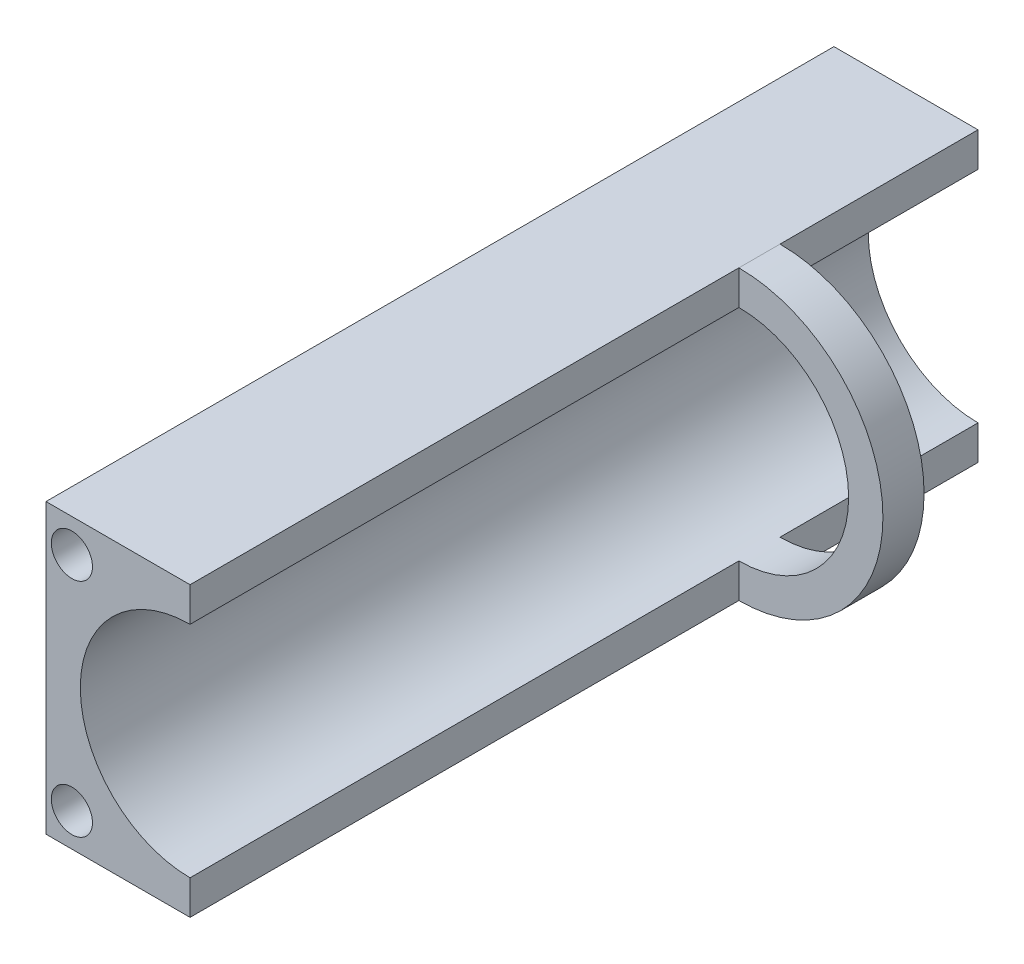
ISO-10303-21;
HEADER;
FILE_DESCRIPTION(('STEP AP214'),'2;1');
FILE_NAME('part.step','',(''),(''),'','','');
FILE_SCHEMA(('AUTOMOTIVE_DESIGN { 1 0 10303 214 1 1 1 1 }'));
ENDSEC;
DATA;
#1=APPLICATION_CONTEXT('core data for automotive mechanical design processes');
#2=APPLICATION_PROTOCOL_DEFINITION('international standard','automotive_design',2000,#1);
#3=PRODUCT_CONTEXT('',#1,'mechanical');
#4=PRODUCT('Part','Part','',(#3));
#5=PRODUCT_RELATED_PRODUCT_CATEGORY('part','',(#4));
#6=PRODUCT_DEFINITION_FORMATION('','',#4);
#7=PRODUCT_DEFINITION_CONTEXT('part definition',#1,'design');
#8=PRODUCT_DEFINITION('design','',#6,#7);
#9=PRODUCT_DEFINITION_SHAPE('','',#8);
#10=(LENGTH_UNIT() NAMED_UNIT(*) SI_UNIT(.MILLI.,.METRE.));
#11=(NAMED_UNIT(*) PLANE_ANGLE_UNIT() SI_UNIT($,.RADIAN.));
#12=(NAMED_UNIT(*) SI_UNIT($,.STERADIAN.) SOLID_ANGLE_UNIT());
#13=UNCERTAINTY_MEASURE_WITH_UNIT(LENGTH_MEASURE(1.E-05),#10,'distance_accuracy_value','');
#14=(GEOMETRIC_REPRESENTATION_CONTEXT(3) GLOBAL_UNCERTAINTY_ASSIGNED_CONTEXT((#13)) GLOBAL_UNIT_ASSIGNED_CONTEXT((#10,
#11,#12)) REPRESENTATION_CONTEXT('',''));
#15=CARTESIAN_POINT('',(0.,0.,0.));
#16=DIRECTION('',(0.,0.,1.));
#17=DIRECTION('',(1.,0.,0.));
#18=AXIS2_PLACEMENT_3D('',#15,#16,#17);
#19=CARTESIAN_POINT('',(0.,-8.,57.43));
#20=DIRECTION('',(-1.,0.,0.));
#21=DIRECTION('',(0.,-1.,0.));
#22=AXIS2_PLACEMENT_3D('',#19,#20,#21);
#23=PLANE('',#22);
#24=DIRECTION('',(0.,1.,0.));
#25=VECTOR('',#24,1.);
#26=CARTESIAN_POINT('',(0.,-8.,14.43));
#27=LINE('',#26,#25);
#28=CARTESIAN_POINT('',(0.,-10.5,14.43));
#29=VERTEX_POINT('',#28);
#30=CARTESIAN_POINT('',(0.,-8.,14.43));
#31=VERTEX_POINT('',#30);
#32=EDGE_CURVE('E176',#29,#31,#27,.T.);
#33=ORIENTED_EDGE('',*,*,#32,.F.);
#34=DIRECTION('',(0.,0.,-1.));
#35=VECTOR('',#34,1.);
#36=CARTESIAN_POINT('',(0.,-10.5,57.43));
#37=LINE('',#36,#35);
#38=CARTESIAN_POINT('',(0.,-10.5,0.));
#39=VERTEX_POINT('',#38);
#40=EDGE_CURVE('E41',#29,#39,#37,.T.);
#41=ORIENTED_EDGE('',*,*,#40,.T.);
#42=DIRECTION('',(0.,1.,0.));
#43=VECTOR('',#42,1.);
#44=CARTESIAN_POINT('',(0.,-8.,0.));
#45=LINE('',#44,#43);
#46=CARTESIAN_POINT('',(0.,-8.,0.));
#47=VERTEX_POINT('',#46);
#48=EDGE_CURVE('E196',#39,#47,#45,.T.);
#49=ORIENTED_EDGE('',*,*,#48,.T.);
#50=DIRECTION('',(0.,0.,-1.));
#51=VECTOR('',#50,1.);
#52=CARTESIAN_POINT('',(0.,-8.,57.43));
#53=LINE('',#52,#51);
#54=EDGE_CURVE('E55',#31,#47,#53,.T.);
#55=ORIENTED_EDGE('',*,*,#54,.F.);
#56=EDGE_LOOP('',(#33,#41,#49,#55));
#57=FACE_BOUND('',#56,.T.);
#58=ADVANCED_FACE('F33',(#57),#23,.F.);
#59=DIRECTION('',(0.,-1.,0.));
#60=VECTOR('',#59,1.);
#61=CARTESIAN_POINT('',(0.,-8.,17.43));
#62=LINE('',#61,#60);
#63=CARTESIAN_POINT('',(0.,-8.,17.43));
#64=VERTEX_POINT('',#63);
#65=CARTESIAN_POINT('',(0.,-10.5,17.43));
#66=VERTEX_POINT('',#65);
#67=EDGE_CURVE('E170',#64,#66,#62,.T.);
#68=ORIENTED_EDGE('',*,*,#67,.F.);
#69=CARTESIAN_POINT('',(0.,-8.,57.43));
#70=VERTEX_POINT('',#69);
#71=EDGE_CURVE('E219',#70,#64,#53,.T.);
#72=ORIENTED_EDGE('',*,*,#71,.F.);
#73=DIRECTION('',(0.,1.,0.));
#74=VECTOR('',#73,1.);
#75=CARTESIAN_POINT('',(0.,-8.,57.43));
#76=LINE('',#75,#74);
#77=CARTESIAN_POINT('',(0.,-10.5,57.43));
#78=VERTEX_POINT('',#77);
#79=EDGE_CURVE('E182',#78,#70,#76,.T.);
#80=ORIENTED_EDGE('',*,*,#79,.F.);
#81=EDGE_CURVE('E11',#78,#66,#37,.T.);
#82=ORIENTED_EDGE('',*,*,#81,.T.);
#83=EDGE_LOOP('',(#68,#72,#80,#82));
#84=FACE_BOUND('',#83,.T.);
#85=ADVANCED_FACE('F272',(#84),#23,.F.);
#86=CARTESIAN_POINT('',(0.,10.5,57.43));
#87=DIRECTION('',(-1.,0.,0.));
#88=DIRECTION('',(0.,-1.,0.));
#89=AXIS2_PLACEMENT_3D('',#86,#87,#88);
#90=PLANE('',#89);
#91=DIRECTION('',(0.,1.,0.));
#92=VECTOR('',#91,1.);
#93=CARTESIAN_POINT('',(0.,10.5,14.43));
#94=LINE('',#93,#92);
#95=CARTESIAN_POINT('',(0.,8.,14.43));
#96=VERTEX_POINT('',#95);
#97=CARTESIAN_POINT('',(0.,10.5,14.43));
#98=VERTEX_POINT('',#97);
#99=EDGE_CURVE('E173',#96,#98,#94,.T.);
#100=ORIENTED_EDGE('',*,*,#99,.F.);
#101=DIRECTION('',(0.,0.,-1.));
#102=VECTOR('',#101,1.);
#103=CARTESIAN_POINT('',(0.,8.,57.43));
#104=LINE('',#103,#102);
#105=CARTESIAN_POINT('',(0.,8.,0.));
#106=VERTEX_POINT('',#105);
#107=EDGE_CURVE('E216',#96,#106,#104,.T.);
#108=ORIENTED_EDGE('',*,*,#107,.T.);
#109=DIRECTION('',(0.,1.,0.));
#110=VECTOR('',#109,1.);
#111=CARTESIAN_POINT('',(0.,10.5,0.));
#112=LINE('',#111,#110);
#113=CARTESIAN_POINT('',(0.,10.5,0.));
#114=VERTEX_POINT('',#113);
#115=EDGE_CURVE('E201',#106,#114,#112,.T.);
#116=ORIENTED_EDGE('',*,*,#115,.T.);
#117=DIRECTION('',(0.,0.,-1.));
#118=VECTOR('',#117,1.);
#119=CARTESIAN_POINT('',(0.,10.5,57.43));
#120=LINE('',#119,#118);
#121=EDGE_CURVE('E212',#98,#114,#120,.T.);
#122=ORIENTED_EDGE('',*,*,#121,.F.);
#123=EDGE_LOOP('',(#100,#108,#116,#122));
#124=FACE_BOUND('',#123,.T.);
#125=ADVANCED_FACE('F239',(#124),#90,.F.);
#126=DIRECTION('',(0.,-1.,0.));
#127=VECTOR('',#126,1.);
#128=CARTESIAN_POINT('',(0.,10.5,17.43));
#129=LINE('',#128,#127);
#130=CARTESIAN_POINT('',(0.,10.5,17.43));
#131=VERTEX_POINT('',#130);
#132=CARTESIAN_POINT('',(0.,8.,17.43));
#133=VERTEX_POINT('',#132);
#134=EDGE_CURVE('E168',#131,#133,#129,.T.);
#135=ORIENTED_EDGE('',*,*,#134,.F.);
#136=CARTESIAN_POINT('',(0.,10.5,57.43));
#137=VERTEX_POINT('',#136);
#138=EDGE_CURVE('E213',#137,#131,#120,.T.);
#139=ORIENTED_EDGE('',*,*,#138,.F.);
#140=DIRECTION('',(0.,1.,0.));
#141=VECTOR('',#140,1.);
#142=CARTESIAN_POINT('',(0.,10.5,57.43));
#143=LINE('',#142,#141);
#144=CARTESIAN_POINT('',(0.,8.,57.43));
#145=VERTEX_POINT('',#144);
#146=EDGE_CURVE('E187',#145,#137,#143,.T.);
#147=ORIENTED_EDGE('',*,*,#146,.F.);
#148=EDGE_CURVE('E217',#145,#133,#104,.T.);
#149=ORIENTED_EDGE('',*,*,#148,.T.);
#150=EDGE_LOOP('',(#135,#139,#147,#149));
#151=FACE_BOUND('',#150,.T.);
#152=ADVANCED_FACE('F251',(#151),#90,.F.);
#153=CARTESIAN_POINT('',(-10.5,-10.5,57.43));
#154=DIRECTION('',(0.,1.,0.));
#155=DIRECTION('',(-1.,0.,0.));
#156=AXIS2_PLACEMENT_3D('',#153,#154,#155);
#157=PLANE('',#156);
#158=DIRECTION('',(1.,0.,0.));
#159=VECTOR('',#158,1.);
#160=CARTESIAN_POINT('',(-10.5,-10.5,0.));
#161=LINE('',#160,#159);
#162=CARTESIAN_POINT('',(-10.5,-10.5,0.));
#163=VERTEX_POINT('',#162);
#164=EDGE_CURVE('E178',#163,#39,#161,.T.);
#165=ORIENTED_EDGE('',*,*,#164,.T.);
#166=ORIENTED_EDGE('',*,*,#40,.F.);
#167=DIRECTION('',(0.,0.,-1.));
#168=VECTOR('',#167,1.);
#169=CARTESIAN_POINT('',(0.,-10.5,0.));
#170=LINE('',#169,#168);
#171=EDGE_CURVE('E48',#66,#29,#170,.T.);
#172=ORIENTED_EDGE('',*,*,#171,.F.);
#173=ORIENTED_EDGE('',*,*,#81,.F.);
#174=DIRECTION('',(1.,0.,0.));
#175=VECTOR('',#174,1.);
#176=CARTESIAN_POINT('',(-10.5,-10.5,57.43));
#177=LINE('',#176,#175);
#178=CARTESIAN_POINT('',(-10.5,-10.5,57.43));
#179=VERTEX_POINT('',#178);
#180=EDGE_CURVE('E179',#179,#78,#177,.T.);
#181=ORIENTED_EDGE('',*,*,#180,.F.);
#182=DIRECTION('',(0.,0.,-1.));
#183=VECTOR('',#182,1.);
#184=CARTESIAN_POINT('',(-10.5,-10.5,57.43));
#185=LINE('',#184,#183);
#186=EDGE_CURVE('E193',#179,#163,#185,.T.);
#187=ORIENTED_EDGE('',*,*,#186,.T.);
#188=EDGE_LOOP('',(#165,#166,#172,#173,#181,#187));
#189=FACE_BOUND('',#188,.T.);
#190=ADVANCED_FACE('F35',(#189),#157,.F.);
#191=CARTESIAN_POINT('',(0.,0.,57.43));
#192=DIRECTION('',(0.,0.,-1.));
#193=DIRECTION('',(-1.,0.,0.));
#194=AXIS2_PLACEMENT_3D('',#191,#192,#193);
#195=CYLINDRICAL_SURFACE('',#194,8.);
#196=ORIENTED_EDGE('',*,*,#71,.T.);
#197=CARTESIAN_POINT('',(0.,0.,17.43));
#198=DIRECTION('',(0.,0.,-1.));
#199=DIRECTION('',(-1.,0.,0.));
#200=AXIS2_PLACEMENT_3D('',#197,#198,#199);
#201=CIRCLE('',#200,8.);
#202=EDGE_CURVE('E159',#133,#64,#201,.T.);
#203=ORIENTED_EDGE('',*,*,#202,.F.);
#204=ORIENTED_EDGE('',*,*,#148,.F.);
#205=CARTESIAN_POINT('',(0.,0.,57.43));
#206=DIRECTION('',(0.,0.,-1.));
#207=DIRECTION('',(1.,0.,0.));
#208=AXIS2_PLACEMENT_3D('',#205,#206,#207);
#209=CIRCLE('',#208,8.);
#210=EDGE_CURVE('E185',#70,#145,#209,.T.);
#211=ORIENTED_EDGE('',*,*,#210,.F.);
#212=EDGE_LOOP('',(#196,#203,#204,#211));
#213=FACE_BOUND('',#212,.T.);
#214=CARTESIAN_POINT('',(0.,0.,14.43));
#215=DIRECTION('',(0.,0.,-1.));
#216=DIRECTION('',(-1.,0.,0.));
#217=AXIS2_PLACEMENT_3D('',#214,#215,#216);
#218=CIRCLE('',#217,8.);
#219=EDGE_CURVE('E162',#96,#31,#218,.T.);
#220=ORIENTED_EDGE('',*,*,#219,.T.);
#221=ORIENTED_EDGE('',*,*,#54,.T.);
#222=CARTESIAN_POINT('',(0.,0.,0.));
#223=DIRECTION('',(0.,0.,-1.));
#224=DIRECTION('',(1.,0.,0.));
#225=AXIS2_PLACEMENT_3D('',#222,#223,#224);
#226=CIRCLE('',#225,8.);
#227=EDGE_CURVE('E198',#47,#106,#226,.T.);
#228=ORIENTED_EDGE('',*,*,#227,.T.);
#229=ORIENTED_EDGE('',*,*,#107,.F.);
#230=EDGE_LOOP('',(#220,#221,#228,#229));
#231=FACE_BOUND('',#230,.T.);
#232=ADVANCED_FACE('F226',(#213,#231),#195,.F.);
#233=CARTESIAN_POINT('',(0.,10.5,57.43));
#234=DIRECTION('',(0.,-1.,0.));
#235=DIRECTION('',(1.,0.,0.));
#236=AXIS2_PLACEMENT_3D('',#233,#234,#235);
#237=PLANE('',#236);
#238=DIRECTION('',(-1.,0.,0.));
#239=VECTOR('',#238,1.);
#240=CARTESIAN_POINT('',(0.,10.5,0.));
#241=LINE('',#240,#239);
#242=CARTESIAN_POINT('',(-10.5,10.5,0.));
#243=VERTEX_POINT('',#242);
#244=EDGE_CURVE('E204',#114,#243,#241,.T.);
#245=ORIENTED_EDGE('',*,*,#244,.T.);
#246=DIRECTION('',(0.,0.,-1.));
#247=VECTOR('',#246,1.);
#248=CARTESIAN_POINT('',(-10.5,10.5,57.43));
#249=LINE('',#248,#247);
#250=CARTESIAN_POINT('',(-10.5,10.5,57.43));
#251=VERTEX_POINT('',#250);
#252=EDGE_CURVE('E209',#251,#243,#249,.T.);
#253=ORIENTED_EDGE('',*,*,#252,.F.);
#254=DIRECTION('',(-1.,0.,0.));
#255=VECTOR('',#254,1.);
#256=CARTESIAN_POINT('',(0.,10.5,57.43));
#257=LINE('',#256,#255);
#258=EDGE_CURVE('E189',#137,#251,#257,.T.);
#259=ORIENTED_EDGE('',*,*,#258,.F.);
#260=ORIENTED_EDGE('',*,*,#138,.T.);
#261=DIRECTION('',(0.,0.,-1.));
#262=VECTOR('',#261,1.);
#263=CARTESIAN_POINT('',(0.,10.5,0.));
#264=LINE('',#263,#262);
#265=EDGE_CURVE('E165',#98,#131,#264,.F.);
#266=ORIENTED_EDGE('',*,*,#265,.F.);
#267=ORIENTED_EDGE('',*,*,#121,.T.);
#268=EDGE_LOOP('',(#245,#253,#259,#260,#266,#267));
#269=FACE_BOUND('',#268,.T.);
#270=ADVANCED_FACE('F256',(#269),#237,.F.);
#271=CARTESIAN_POINT('',(-10.5,10.5,57.43));
#272=DIRECTION('',(1.,0.,0.));
#273=DIRECTION('',(0.,1.,0.));
#274=AXIS2_PLACEMENT_3D('',#271,#272,#273);
#275=PLANE('',#274);
#276=DIRECTION('',(0.,-1.,0.));
#277=VECTOR('',#276,1.);
#278=CARTESIAN_POINT('',(-10.5,10.5,0.));
#279=LINE('',#278,#277);
#280=EDGE_CURVE('E183',#243,#163,#279,.T.);
#281=ORIENTED_EDGE('',*,*,#280,.T.);
#282=ORIENTED_EDGE('',*,*,#186,.F.);
#283=DIRECTION('',(0.,-1.,0.));
#284=VECTOR('',#283,1.);
#285=CARTESIAN_POINT('',(-10.5,10.5,57.43));
#286=LINE('',#285,#284);
#287=EDGE_CURVE('E191',#251,#179,#286,.T.);
#288=ORIENTED_EDGE('',*,*,#287,.F.);
#289=ORIENTED_EDGE('',*,*,#252,.T.);
#290=EDGE_LOOP('',(#281,#282,#288,#289));
#291=FACE_BOUND('',#290,.T.);
#292=ADVANCED_FACE('F268',(#291),#275,.F.);
#293=CARTESIAN_POINT('',(0.,0.,57.43));
#294=DIRECTION('',(0.,0.,1.));
#295=DIRECTION('',(1.,0.,0.));
#296=AXIS2_PLACEMENT_3D('',#293,#294,#295);
#297=PLANE('',#296);
#298=CARTESIAN_POINT('',(-8.61334429823863,8.08,57.43));
#299=DIRECTION('',(0.,0.,1.));
#300=DIRECTION('',(1.,0.,0.));
#301=AXIS2_PLACEMENT_3D('',#298,#299,#300);
#302=CIRCLE('',#301,1.5);
#303=CARTESIAN_POINT('',(-7.11334429823863,8.08,57.43));
#304=VERTEX_POINT('',#303);
#305=EDGE_CURVE('E147',#304,#304,#302,.T.);
#306=ORIENTED_EDGE('',*,*,#305,.F.);
#307=EDGE_LOOP('',(#306));
#308=FACE_BOUND('',#307,.T.);
#309=CARTESIAN_POINT('',(-8.61334429823863,-8.08,57.43));
#310=DIRECTION('',(0.,0.,1.));
#311=DIRECTION('',(1.,0.,0.));
#312=AXIS2_PLACEMENT_3D('',#309,#310,#311);
#313=CIRCLE('',#312,1.5);
#314=CARTESIAN_POINT('',(-7.11334429823863,-8.08,57.43));
#315=VERTEX_POINT('',#314);
#316=EDGE_CURVE('E150',#315,#315,#313,.T.);
#317=ORIENTED_EDGE('',*,*,#316,.F.);
#318=EDGE_LOOP('',(#317));
#319=FACE_BOUND('',#318,.T.);
#320=ORIENTED_EDGE('',*,*,#180,.T.);
#321=ORIENTED_EDGE('',*,*,#79,.T.);
#322=ORIENTED_EDGE('',*,*,#210,.T.);
#323=ORIENTED_EDGE('',*,*,#146,.T.);
#324=ORIENTED_EDGE('',*,*,#258,.T.);
#325=ORIENTED_EDGE('',*,*,#287,.T.);
#326=EDGE_LOOP('',(#320,#321,#322,#323,#324,#325));
#327=FACE_BOUND('',#326,.T.);
#328=ADVANCED_FACE('F260',(#308,#319,#327),#297,.T.);
#329=CARTESIAN_POINT('',(0.,0.,0.));
#330=DIRECTION('',(0.,0.,1.));
#331=DIRECTION('',(1.,0.,0.));
#332=AXIS2_PLACEMENT_3D('',#329,#330,#331);
#333=PLANE('',#332);
#334=CARTESIAN_POINT('',(-8.61334429823864,-8.08,0.));
#335=DIRECTION('',(0.,0.,-1.));
#336=DIRECTION('',(-1.,0.,0.));
#337=AXIS2_PLACEMENT_3D('',#334,#335,#336);
#338=CIRCLE('',#337,1.5);
#339=CARTESIAN_POINT('',(-10.1133442982386,-8.08,0.));
#340=VERTEX_POINT('',#339);
#341=EDGE_CURVE('E141',#340,#340,#338,.T.);
#342=ORIENTED_EDGE('',*,*,#341,.F.);
#343=EDGE_LOOP('',(#342));
#344=FACE_BOUND('',#343,.T.);
#345=CARTESIAN_POINT('',(-8.61334429823864,8.08,0.));
#346=DIRECTION('',(0.,0.,-1.));
#347=DIRECTION('',(-1.,0.,0.));
#348=AXIS2_PLACEMENT_3D('',#345,#346,#347);
#349=CIRCLE('',#348,1.5);
#350=CARTESIAN_POINT('',(-10.1133442982386,8.08,0.));
#351=VERTEX_POINT('',#350);
#352=EDGE_CURVE('E144',#351,#351,#349,.T.);
#353=ORIENTED_EDGE('',*,*,#352,.F.);
#354=EDGE_LOOP('',(#353));
#355=FACE_BOUND('',#354,.T.);
#356=ORIENTED_EDGE('',*,*,#164,.F.);
#357=ORIENTED_EDGE('',*,*,#280,.F.);
#358=ORIENTED_EDGE('',*,*,#244,.F.);
#359=ORIENTED_EDGE('',*,*,#115,.F.);
#360=ORIENTED_EDGE('',*,*,#227,.F.);
#361=ORIENTED_EDGE('',*,*,#48,.F.);
#362=EDGE_LOOP('',(#356,#357,#358,#359,#360,#361));
#363=FACE_BOUND('',#362,.T.);
#364=ADVANCED_FACE('F233',(#344,#355,#363),#333,.F.);
#365=CARTESIAN_POINT('',(0.,-10.5,14.43));
#366=DIRECTION('',(0.,0.,1.));
#367=DIRECTION('',(1.,0.,0.));
#368=AXIS2_PLACEMENT_3D('',#365,#366,#367);
#369=PLANE('',#368);
#370=CARTESIAN_POINT('',(0.,0.,14.43));
#371=DIRECTION('',(0.,0.,-1.));
#372=DIRECTION('',(-1.,0.,0.));
#373=AXIS2_PLACEMENT_3D('',#370,#371,#372);
#374=CIRCLE('',#373,10.5);
#375=EDGE_CURVE('E153',#98,#29,#374,.T.);
#376=ORIENTED_EDGE('',*,*,#375,.T.);
#377=ORIENTED_EDGE('',*,*,#32,.T.);
#378=ORIENTED_EDGE('',*,*,#219,.F.);
#379=ORIENTED_EDGE('',*,*,#99,.T.);
#380=EDGE_LOOP('',(#376,#377,#378,#379));
#381=FACE_BOUND('',#380,.T.);
#382=ADVANCED_FACE('F242',(#381),#369,.F.);
#383=CARTESIAN_POINT('',(0.,-10.5,17.43));
#384=DIRECTION('',(0.,0.,-1.));
#385=DIRECTION('',(-1.,0.,0.));
#386=AXIS2_PLACEMENT_3D('',#383,#384,#385);
#387=PLANE('',#386);
#388=ORIENTED_EDGE('',*,*,#202,.T.);
#389=ORIENTED_EDGE('',*,*,#67,.T.);
#390=CARTESIAN_POINT('',(0.,0.,17.43));
#391=DIRECTION('',(0.,0.,-1.));
#392=DIRECTION('',(-1.,0.,0.));
#393=AXIS2_PLACEMENT_3D('',#390,#391,#392);
#394=CIRCLE('',#393,10.5);
#395=EDGE_CURVE('E156',#131,#66,#394,.T.);
#396=ORIENTED_EDGE('',*,*,#395,.F.);
#397=ORIENTED_EDGE('',*,*,#134,.T.);
#398=EDGE_LOOP('',(#388,#389,#396,#397));
#399=FACE_BOUND('',#398,.T.);
#400=ADVANCED_FACE('F248',(#399),#387,.F.);
#401=CARTESIAN_POINT('',(0.,0.,0.));
#402=DIRECTION('',(0.,0.,-1.));
#403=DIRECTION('',(-1.,0.,0.));
#404=AXIS2_PLACEMENT_3D('',#401,#402,#403);
#405=CYLINDRICAL_SURFACE('',#404,10.5);
#406=ORIENTED_EDGE('',*,*,#395,.T.);
#407=ORIENTED_EDGE('',*,*,#171,.T.);
#408=ORIENTED_EDGE('',*,*,#375,.F.);
#409=ORIENTED_EDGE('',*,*,#265,.T.);
#410=EDGE_LOOP('',(#406,#407,#408,#409));
#411=FACE_BOUND('',#410,.T.);
#412=ADVANCED_FACE('F244',(#411),#405,.T.);
#413=CARTESIAN_POINT('',(-8.61334429823863,-8.08,57.33));
#414=DIRECTION('',(0.,0.,1.));
#415=DIRECTION('',(1.,0.,0.));
#416=AXIS2_PLACEMENT_3D('',#413,#414,#415);
#417=CYLINDRICAL_SURFACE('',#416,1.5);
#418=ORIENTED_EDGE('',*,*,#316,.T.);
#419=EDGE_LOOP('',(#418));
#420=FACE_BOUND('',#419,.T.);
#421=CARTESIAN_POINT('',(-8.61334429823863,-8.08,54.43));
#422=DIRECTION('',(0.,0.,1.));
#423=DIRECTION('',(1.,0.,0.));
#424=AXIS2_PLACEMENT_3D('',#421,#422,#423);
#425=CIRCLE('',#424,1.49999999999999);
#426=CARTESIAN_POINT('',(-7.11334429823864,-8.08,54.43));
#427=VERTEX_POINT('',#426);
#428=EDGE_CURVE('E138',#427,#427,#425,.T.);
#429=ORIENTED_EDGE('',*,*,#428,.F.);
#430=EDGE_LOOP('',(#429));
#431=FACE_BOUND('',#430,.T.);
#432=ADVANCED_FACE('F299',(#420,#431),#417,.F.);
#433=CARTESIAN_POINT('',(-8.61334429823863,8.08,57.33));
#434=DIRECTION('',(0.,0.,1.));
#435=DIRECTION('',(1.,0.,0.));
#436=AXIS2_PLACEMENT_3D('',#433,#434,#435);
#437=CYLINDRICAL_SURFACE('',#436,1.5);
#438=ORIENTED_EDGE('',*,*,#305,.T.);
#439=EDGE_LOOP('',(#438));
#440=FACE_BOUND('',#439,.T.);
#441=CARTESIAN_POINT('',(-8.61334429823863,8.08,54.43));
#442=DIRECTION('',(0.,0.,1.));
#443=DIRECTION('',(1.,0.,0.));
#444=AXIS2_PLACEMENT_3D('',#441,#442,#443);
#445=CIRCLE('',#444,1.49999999999999);
#446=CARTESIAN_POINT('',(-7.11334429823864,8.08,54.43));
#447=VERTEX_POINT('',#446);
#448=EDGE_CURVE('E133',#447,#447,#445,.T.);
#449=ORIENTED_EDGE('',*,*,#448,.F.);
#450=EDGE_LOOP('',(#449));
#451=FACE_BOUND('',#450,.T.);
#452=ADVANCED_FACE('F302',(#440,#451),#437,.F.);
#453=CARTESIAN_POINT('',(-8.61334429823864,8.08,0.1));
#454=DIRECTION('',(0.,0.,-1.));
#455=DIRECTION('',(-1.,0.,0.));
#456=AXIS2_PLACEMENT_3D('',#453,#454,#455);
#457=CYLINDRICAL_SURFACE('',#456,1.5);
#458=ORIENTED_EDGE('',*,*,#352,.T.);
#459=EDGE_LOOP('',(#458));
#460=FACE_BOUND('',#459,.T.);
#461=CARTESIAN_POINT('',(-8.61334429823864,8.08,3.));
#462=DIRECTION('',(0.,0.,-1.));
#463=DIRECTION('',(-1.,0.,0.));
#464=AXIS2_PLACEMENT_3D('',#461,#462,#463);
#465=CIRCLE('',#464,1.49999999999999);
#466=CARTESIAN_POINT('',(-10.1133442982386,8.08,3.));
#467=VERTEX_POINT('',#466);
#468=EDGE_CURVE('E128',#467,#467,#465,.T.);
#469=ORIENTED_EDGE('',*,*,#468,.F.);
#470=EDGE_LOOP('',(#469));
#471=FACE_BOUND('',#470,.T.);
#472=ADVANCED_FACE('F306',(#460,#471),#457,.F.);
#473=CARTESIAN_POINT('',(-8.61334429823864,-8.08,0.1));
#474=DIRECTION('',(0.,0.,-1.));
#475=DIRECTION('',(-1.,0.,0.));
#476=AXIS2_PLACEMENT_3D('',#473,#474,#475);
#477=CYLINDRICAL_SURFACE('',#476,1.5);
#478=ORIENTED_EDGE('',*,*,#341,.T.);
#479=EDGE_LOOP('',(#478));
#480=FACE_BOUND('',#479,.T.);
#481=CARTESIAN_POINT('',(-8.61334429823864,-8.08,3.));
#482=DIRECTION('',(0.,0.,-1.));
#483=DIRECTION('',(-1.,0.,0.));
#484=AXIS2_PLACEMENT_3D('',#481,#482,#483);
#485=CIRCLE('',#484,1.49999999999999);
#486=CARTESIAN_POINT('',(-10.1133442982386,-8.08,3.));
#487=VERTEX_POINT('',#486);
#488=EDGE_CURVE('E130',#487,#487,#485,.T.);
#489=ORIENTED_EDGE('',*,*,#488,.F.);
#490=EDGE_LOOP('',(#489));
#491=FACE_BOUND('',#490,.T.);
#492=ADVANCED_FACE('F310',(#480,#491),#477,.F.);
#493=CARTESIAN_POINT('',(-8.61334429823863,-8.08,54.43));
#494=DIRECTION('',(0.,0.,1.));
#495=DIRECTION('',(1.,0.,0.));
#496=AXIS2_PLACEMENT_3D('',#493,#494,#495);
#497=CONICAL_SURFACE('',#496,1.49999999999999,1.02974425867665);
#498=CARTESIAN_POINT('',(-8.61334429823863,-8.08,53.5287090714587));
#499=VERTEX_POINT('',#498);
#500=VERTEX_LOOP('',#499);
#501=FACE_BOUND('',#500,.T.);
#502=ORIENTED_EDGE('',*,*,#428,.T.);
#503=EDGE_LOOP('',(#502));
#504=FACE_BOUND('',#503,.T.);
#505=ADVANCED_FACE('F314',(#501,#504),#497,.F.);
#506=CARTESIAN_POINT('',(-8.61334429823863,8.08,54.43));
#507=DIRECTION('',(0.,0.,1.));
#508=DIRECTION('',(1.,0.,0.));
#509=AXIS2_PLACEMENT_3D('',#506,#507,#508);
#510=CONICAL_SURFACE('',#509,1.49999999999999,1.02974425867665);
#511=CARTESIAN_POINT('',(-8.61334429823863,8.08,53.5287090714587));
#512=VERTEX_POINT('',#511);
#513=VERTEX_LOOP('',#512);
#514=FACE_BOUND('',#513,.T.);
#515=ORIENTED_EDGE('',*,*,#448,.T.);
#516=EDGE_LOOP('',(#515));
#517=FACE_BOUND('',#516,.T.);
#518=ADVANCED_FACE('F318',(#514,#517),#510,.F.);
#519=CARTESIAN_POINT('',(-8.61334429823864,-8.08,3.));
#520=DIRECTION('',(0.,0.,-1.));
#521=DIRECTION('',(-1.,0.,0.));
#522=AXIS2_PLACEMENT_3D('',#519,#520,#521);
#523=CONICAL_SURFACE('',#522,1.49999999999999,1.02974425867665);
#524=CARTESIAN_POINT('',(-8.61334429823864,-8.08,3.90129092854134));
#525=VERTEX_POINT('',#524);
#526=VERTEX_LOOP('',#525);
#527=FACE_BOUND('',#526,.T.);
#528=ORIENTED_EDGE('',*,*,#488,.T.);
#529=EDGE_LOOP('',(#528));
#530=FACE_BOUND('',#529,.T.);
#531=ADVANCED_FACE('F124',(#527,#530),#523,.F.);
#532=CARTESIAN_POINT('',(-8.61334429823864,8.08,3.));
#533=DIRECTION('',(0.,0.,-1.));
#534=DIRECTION('',(-1.,0.,0.));
#535=AXIS2_PLACEMENT_3D('',#532,#533,#534);
#536=CONICAL_SURFACE('',#535,1.49999999999999,1.02974425867665);
#537=CARTESIAN_POINT('',(-8.61334429823864,8.08,3.90129092854134));
#538=VERTEX_POINT('',#537);
#539=VERTEX_LOOP('',#538);
#540=FACE_BOUND('',#539,.T.);
#541=ORIENTED_EDGE('',*,*,#468,.T.);
#542=EDGE_LOOP('',(#541));
#543=FACE_BOUND('',#542,.T.);
#544=ADVANCED_FACE('F121',(#540,#543),#536,.F.);
#545=CLOSED_SHELL('',(#58,#85,#125,#152,#190,#232,#270,#292,#328,#364,#382,#400,#412,#432,#452,
#472,#492,#505,#518,#531,#544));
#546=MANIFOLD_SOLID_BREP('B2',#545);
#547=ADVANCED_BREP_SHAPE_REPRESENTATION('',(#18,#546),#14);
#548=SHAPE_DEFINITION_REPRESENTATION(#9,#547);
ENDSEC;
END-ISO-10303-21;
